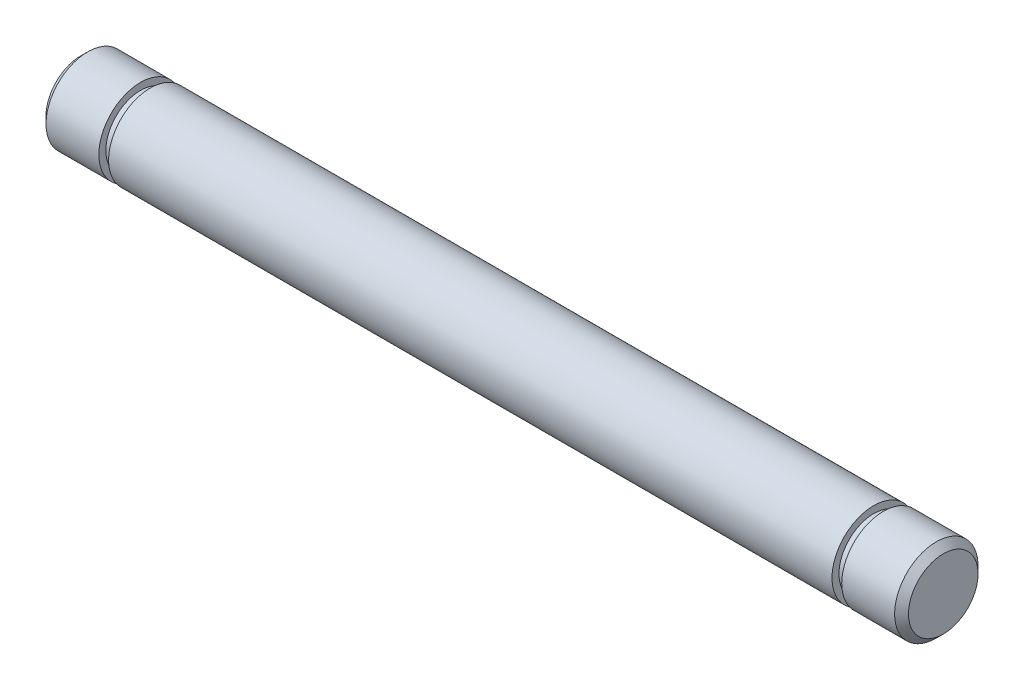
ISO-10303-21;
HEADER;
FILE_DESCRIPTION(('STEP AP214'),'2;1');
FILE_NAME('part.step','',(''),(''),'','','');
FILE_SCHEMA(('AUTOMOTIVE_DESIGN { 1 0 10303 214 1 1 1 1 }'));
ENDSEC;
DATA;
#1=APPLICATION_CONTEXT('core data for automotive mechanical design processes');
#2=APPLICATION_PROTOCOL_DEFINITION('international standard','automotive_design',2000,#1);
#3=PRODUCT_CONTEXT('',#1,'mechanical');
#4=PRODUCT('Part','Part','',(#3));
#5=PRODUCT_RELATED_PRODUCT_CATEGORY('part','',(#4));
#6=PRODUCT_DEFINITION_FORMATION('','',#4);
#7=PRODUCT_DEFINITION_CONTEXT('part definition',#1,'design');
#8=PRODUCT_DEFINITION('design','',#6,#7);
#9=PRODUCT_DEFINITION_SHAPE('','',#8);
#10=(LENGTH_UNIT() NAMED_UNIT(*) SI_UNIT(.MILLI.,.METRE.));
#11=(NAMED_UNIT(*) PLANE_ANGLE_UNIT() SI_UNIT($,.RADIAN.));
#12=(NAMED_UNIT(*) SI_UNIT($,.STERADIAN.) SOLID_ANGLE_UNIT());
#13=UNCERTAINTY_MEASURE_WITH_UNIT(LENGTH_MEASURE(1.E-05),#10,'distance_accuracy_value','');
#14=(GEOMETRIC_REPRESENTATION_CONTEXT(3) GLOBAL_UNCERTAINTY_ASSIGNED_CONTEXT((#13)) GLOBAL_UNIT_ASSIGNED_CONTEXT((#10,
#11,#12)) REPRESENTATION_CONTEXT('',''));
#15=CARTESIAN_POINT('',(0.,0.,0.));
#16=DIRECTION('',(0.,0.,1.));
#17=DIRECTION('',(1.,0.,0.));
#18=AXIS2_PLACEMENT_3D('',#15,#16,#17);
#19=CARTESIAN_POINT('',(62.,0.,0.));
#20=DIRECTION('',(-1.,0.,0.));
#21=DIRECTION('',(0.,0.,1.));
#22=AXIS2_PLACEMENT_3D('',#19,#20,#21);
#23=CYLINDRICAL_SURFACE('',#22,3.);
#24=CARTESIAN_POINT('',(5.,0.,0.));
#25=DIRECTION('',(1.,0.,0.));
#26=DIRECTION('',(0.,0.,-1.));
#27=AXIS2_PLACEMENT_3D('',#24,#25,#26);
#28=CIRCLE('',#27,3.);
#29=CARTESIAN_POINT('',(5.,0.,-3.));
#30=VERTEX_POINT('',#29);
#31=EDGE_CURVE('E48',#30,#30,#28,.T.);
#32=ORIENTED_EDGE('',*,*,#31,.T.);
#33=EDGE_LOOP('',(#32));
#34=FACE_BOUND('',#33,.T.);
#35=CARTESIAN_POINT('',(57.,0.,0.));
#36=DIRECTION('',(1.,0.,0.));
#37=DIRECTION('',(0.,0.,-1.));
#38=AXIS2_PLACEMENT_3D('',#35,#36,#37);
#39=CIRCLE('',#38,3.);
#40=CARTESIAN_POINT('',(57.,0.,-3.));
#41=VERTEX_POINT('',#40);
#42=EDGE_CURVE('E55',#41,#41,#39,.T.);
#43=ORIENTED_EDGE('',*,*,#42,.F.);
#44=EDGE_LOOP('',(#43));
#45=FACE_BOUND('',#44,.T.);
#46=ADVANCED_FACE('F31',(#34,#45),#23,.T.);
#47=CARTESIAN_POINT('',(0.5,0.,0.));
#48=DIRECTION('',(-1.,0.,0.));
#49=DIRECTION('',(0.,0.,1.));
#50=AXIS2_PLACEMENT_3D('',#47,#48,#49);
#51=CIRCLE('',#50,3.);
#52=CARTESIAN_POINT('',(0.5,0.,3.));
#53=VERTEX_POINT('',#52);
#54=EDGE_CURVE('E39',#53,#53,#51,.T.);
#55=ORIENTED_EDGE('',*,*,#54,.F.);
#56=EDGE_LOOP('',(#55));
#57=FACE_BOUND('',#56,.T.);
#58=CARTESIAN_POINT('',(4.3,0.,0.));
#59=DIRECTION('',(1.,0.,0.));
#60=DIRECTION('',(0.,0.,-1.));
#61=AXIS2_PLACEMENT_3D('',#58,#59,#60);
#62=CIRCLE('',#61,3.);
#63=CARTESIAN_POINT('',(4.3,0.,-3.));
#64=VERTEX_POINT('',#63);
#65=EDGE_CURVE('E51',#64,#64,#62,.T.);
#66=ORIENTED_EDGE('',*,*,#65,.F.);
#67=EDGE_LOOP('',(#66));
#68=FACE_BOUND('',#67,.T.);
#69=ADVANCED_FACE('F98',(#57,#68),#23,.T.);
#70=CARTESIAN_POINT('',(0.,0.,0.));
#71=DIRECTION('',(1.,0.,0.));
#72=DIRECTION('',(0.,0.,-1.));
#73=AXIS2_PLACEMENT_3D('',#70,#71,#72);
#74=PLANE('',#73);
#75=CARTESIAN_POINT('',(0.,0.,0.));
#76=DIRECTION('',(-1.,0.,0.));
#77=DIRECTION('',(0.,0.,1.));
#78=AXIS2_PLACEMENT_3D('',#75,#76,#77);
#79=CIRCLE('',#78,2.5);
#80=CARTESIAN_POINT('',(0.,0.,2.5));
#81=VERTEX_POINT('',#80);
#82=EDGE_CURVE('E10',#81,#81,#79,.T.);
#83=ORIENTED_EDGE('',*,*,#82,.T.);
#84=EDGE_LOOP('',(#83));
#85=FACE_BOUND('',#84,.T.);
#86=ADVANCED_FACE('F33',(#85),#74,.F.);
#87=CARTESIAN_POINT('',(0.5,0.,0.));
#88=DIRECTION('',(1.,0.,0.));
#89=DIRECTION('',(0.,0.,-1.));
#90=AXIS2_PLACEMENT_3D('',#87,#88,#89);
#91=CONICAL_SURFACE('',#90,3.,0.785398163397448);
#92=ORIENTED_EDGE('',*,*,#82,.F.);
#93=EDGE_LOOP('',(#92));
#94=FACE_BOUND('',#93,.T.);
#95=ORIENTED_EDGE('',*,*,#54,.T.);
#96=EDGE_LOOP('',(#95));
#97=FACE_BOUND('',#96,.T.);
#98=ADVANCED_FACE('F128',(#94,#97),#91,.T.);
#99=CARTESIAN_POINT('',(4.3,0.,0.));
#100=DIRECTION('',(1.,0.,0.));
#101=DIRECTION('',(0.,0.,-1.));
#102=AXIS2_PLACEMENT_3D('',#99,#100,#101);
#103=PLANE('',#102);
#104=CARTESIAN_POINT('',(4.3,0.,0.));
#105=DIRECTION('',(1.,0.,0.));
#106=DIRECTION('',(0.,0.,-1.));
#107=AXIS2_PLACEMENT_3D('',#104,#105,#106);
#108=CIRCLE('',#107,2.5);
#109=CARTESIAN_POINT('',(4.3,0.,-2.5));
#110=VERTEX_POINT('',#109);
#111=EDGE_CURVE('E52',#110,#110,#108,.T.);
#112=ORIENTED_EDGE('',*,*,#111,.F.);
#113=EDGE_LOOP('',(#112));
#114=FACE_BOUND('',#113,.T.);
#115=ORIENTED_EDGE('',*,*,#65,.T.);
#116=EDGE_LOOP('',(#115));
#117=FACE_BOUND('',#116,.T.);
#118=ADVANCED_FACE('F126',(#114,#117),#103,.T.);
#119=CARTESIAN_POINT('',(5.,0.,0.));
#120=DIRECTION('',(1.,0.,0.));
#121=DIRECTION('',(0.,0.,-1.));
#122=AXIS2_PLACEMENT_3D('',#119,#120,#121);
#123=PLANE('',#122);
#124=CARTESIAN_POINT('',(5.,0.,0.));
#125=DIRECTION('',(1.,0.,0.));
#126=DIRECTION('',(0.,0.,-1.));
#127=AXIS2_PLACEMENT_3D('',#124,#125,#126);
#128=CIRCLE('',#127,2.5);
#129=CARTESIAN_POINT('',(5.,0.,-2.5));
#130=VERTEX_POINT('',#129);
#131=EDGE_CURVE('E61',#130,#130,#128,.T.);
#132=ORIENTED_EDGE('',*,*,#131,.T.);
#133=EDGE_LOOP('',(#132));
#134=FACE_BOUND('',#133,.T.);
#135=ORIENTED_EDGE('',*,*,#31,.F.);
#136=EDGE_LOOP('',(#135));
#137=FACE_BOUND('',#136,.T.);
#138=ADVANCED_FACE('F122',(#134,#137),#123,.F.);
#139=CARTESIAN_POINT('',(4.3,0.,0.));
#140=DIRECTION('',(1.,0.,0.));
#141=DIRECTION('',(0.,0.,-1.));
#142=AXIS2_PLACEMENT_3D('',#139,#140,#141);
#143=CYLINDRICAL_SURFACE('',#142,2.5);
#144=ORIENTED_EDGE('',*,*,#111,.T.);
#145=EDGE_LOOP('',(#144));
#146=FACE_BOUND('',#145,.T.);
#147=ORIENTED_EDGE('',*,*,#131,.F.);
#148=EDGE_LOOP('',(#147));
#149=FACE_BOUND('',#148,.T.);
#150=ADVANCED_FACE('F114',(#146,#149),#143,.T.);
#151=CARTESIAN_POINT('',(57.7,0.,0.));
#152=DIRECTION('',(1.,0.,0.));
#153=DIRECTION('',(0.,0.,-1.));
#154=AXIS2_PLACEMENT_3D('',#151,#152,#153);
#155=PLANE('',#154);
#156=CARTESIAN_POINT('',(57.7,0.,0.));
#157=DIRECTION('',(1.,0.,0.));
#158=DIRECTION('',(0.,0.,-1.));
#159=AXIS2_PLACEMENT_3D('',#156,#157,#158);
#160=CIRCLE('',#159,2.5);
#161=CARTESIAN_POINT('',(57.7,0.,-2.5));
#162=VERTEX_POINT('',#161);
#163=EDGE_CURVE('E57',#162,#162,#160,.T.);
#164=ORIENTED_EDGE('',*,*,#163,.T.);
#165=EDGE_LOOP('',(#164));
#166=FACE_BOUND('',#165,.T.);
#167=CARTESIAN_POINT('',(57.7,0.,0.));
#168=DIRECTION('',(1.,0.,0.));
#169=DIRECTION('',(0.,0.,-1.));
#170=AXIS2_PLACEMENT_3D('',#167,#168,#169);
#171=CIRCLE('',#170,3.);
#172=CARTESIAN_POINT('',(57.7,0.,-3.));
#173=VERTEX_POINT('',#172);
#174=EDGE_CURVE('E35',#173,#173,#171,.T.);
#175=ORIENTED_EDGE('',*,*,#174,.F.);
#176=EDGE_LOOP('',(#175));
#177=FACE_BOUND('',#176,.T.);
#178=ADVANCED_FACE('F112',(#166,#177),#155,.F.);
#179=CARTESIAN_POINT('',(57.,0.,0.));
#180=DIRECTION('',(1.,0.,0.));
#181=DIRECTION('',(0.,0.,-1.));
#182=AXIS2_PLACEMENT_3D('',#179,#180,#181);
#183=PLANE('',#182);
#184=CARTESIAN_POINT('',(57.,0.,0.));
#185=DIRECTION('',(1.,0.,0.));
#186=DIRECTION('',(0.,0.,-1.));
#187=AXIS2_PLACEMENT_3D('',#184,#185,#186);
#188=CIRCLE('',#187,2.5);
#189=CARTESIAN_POINT('',(57.,0.,-2.5));
#190=VERTEX_POINT('',#189);
#191=EDGE_CURVE('E63',#190,#190,#188,.T.);
#192=ORIENTED_EDGE('',*,*,#191,.F.);
#193=EDGE_LOOP('',(#192));
#194=FACE_BOUND('',#193,.T.);
#195=ORIENTED_EDGE('',*,*,#42,.T.);
#196=EDGE_LOOP('',(#195));
#197=FACE_BOUND('',#196,.T.);
#198=ADVANCED_FACE('F93',(#194,#197),#183,.T.);
#199=CARTESIAN_POINT('',(57.7,0.,0.));
#200=DIRECTION('',(-1.,0.,0.));
#201=DIRECTION('',(0.,0.,1.));
#202=AXIS2_PLACEMENT_3D('',#199,#200,#201);
#203=CYLINDRICAL_SURFACE('',#202,2.5);
#204=ORIENTED_EDGE('',*,*,#163,.F.);
#205=EDGE_LOOP('',(#204));
#206=FACE_BOUND('',#205,.T.);
#207=ORIENTED_EDGE('',*,*,#191,.T.);
#208=EDGE_LOOP('',(#207));
#209=FACE_BOUND('',#208,.T.);
#210=ADVANCED_FACE('F88',(#206,#209),#203,.T.);
#211=CARTESIAN_POINT('',(62.,2.5,0.));
#212=DIRECTION('',(-1.,0.,0.));
#213=DIRECTION('',(0.,0.,1.));
#214=AXIS2_PLACEMENT_3D('',#211,#212,#213);
#215=PLANE('',#214);
#216=CARTESIAN_POINT('',(62.,0.,0.));
#217=DIRECTION('',(-1.,0.,0.));
#218=DIRECTION('',(0.,0.,1.));
#219=AXIS2_PLACEMENT_3D('',#216,#217,#218);
#220=CIRCLE('',#219,2.5);
#221=CARTESIAN_POINT('',(62.,0.,2.5));
#222=VERTEX_POINT('',#221);
#223=EDGE_CURVE('E54',#222,#222,#220,.T.);
#224=ORIENTED_EDGE('',*,*,#223,.F.);
#225=EDGE_LOOP('',(#224));
#226=FACE_BOUND('',#225,.T.);
#227=ADVANCED_FACE('F83',(#226),#215,.F.);
#228=CARTESIAN_POINT('',(62.,0.,0.));
#229=DIRECTION('',(-1.,0.,0.));
#230=DIRECTION('',(0.,0.,1.));
#231=AXIS2_PLACEMENT_3D('',#228,#229,#230);
#232=CONICAL_SURFACE('',#231,2.5,0.785398163397448);
#233=CARTESIAN_POINT('',(61.5,0.,0.));
#234=DIRECTION('',(-1.,0.,0.));
#235=DIRECTION('',(0.,0.,1.));
#236=AXIS2_PLACEMENT_3D('',#233,#234,#235);
#237=CIRCLE('',#236,3.);
#238=CARTESIAN_POINT('',(61.5,0.,3.));
#239=VERTEX_POINT('',#238);
#240=EDGE_CURVE('E44',#239,#239,#237,.T.);
#241=ORIENTED_EDGE('',*,*,#240,.F.);
#242=EDGE_LOOP('',(#241));
#243=FACE_BOUND('',#242,.T.);
#244=ORIENTED_EDGE('',*,*,#223,.T.);
#245=EDGE_LOOP('',(#244));
#246=FACE_BOUND('',#245,.T.);
#247=ADVANCED_FACE('F80',(#243,#246),#232,.T.);
#248=ORIENTED_EDGE('',*,*,#174,.T.);
#249=EDGE_LOOP('',(#248));
#250=FACE_BOUND('',#249,.T.);
#251=ORIENTED_EDGE('',*,*,#240,.T.);
#252=EDGE_LOOP('',(#251));
#253=FACE_BOUND('',#252,.T.);
#254=ADVANCED_FACE('F78',(#250,#253),#23,.T.);
#255=CLOSED_SHELL('',(#46,#69,#86,#98,#118,#138,#150,#178,#198,#210,#227,#247,#254));
#256=MANIFOLD_SOLID_BREP('B2',#255);
#257=ADVANCED_BREP_SHAPE_REPRESENTATION('',(#18,#256),#14);
#258=SHAPE_DEFINITION_REPRESENTATION(#9,#257);
ENDSEC;
END-ISO-10303-21;
